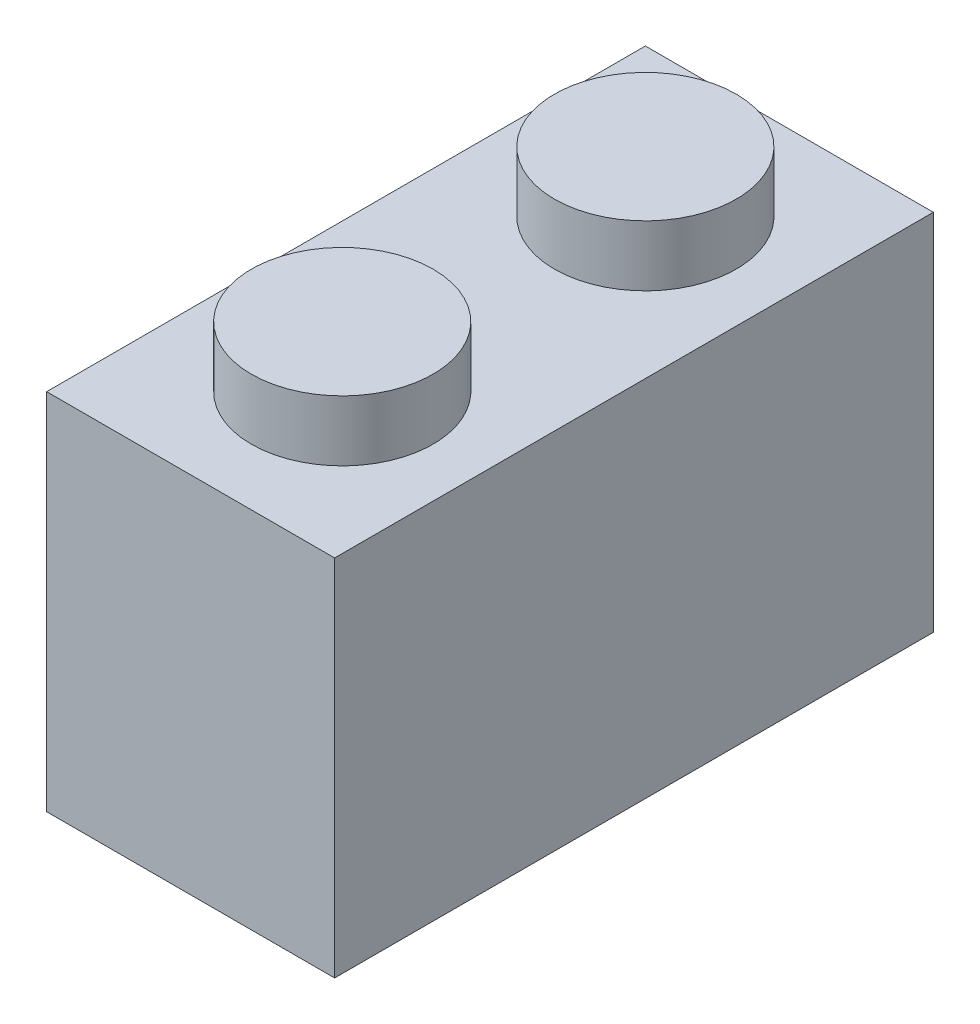
ISO-10303-21;
HEADER;
FILE_DESCRIPTION(('STEP AP214'),'2;1');
FILE_NAME('part.step','',(''),(''),'','','');
FILE_SCHEMA(('AUTOMOTIVE_DESIGN { 1 0 10303 214 1 1 1 1 }'));
ENDSEC;
DATA;
#1=APPLICATION_CONTEXT('core data for automotive mechanical design processes');
#2=APPLICATION_PROTOCOL_DEFINITION('international standard','automotive_design',2000,#1);
#3=PRODUCT_CONTEXT('',#1,'mechanical');
#4=PRODUCT('Part','Part','',(#3));
#5=PRODUCT_RELATED_PRODUCT_CATEGORY('part','',(#4));
#6=PRODUCT_DEFINITION_FORMATION('','',#4);
#7=PRODUCT_DEFINITION_CONTEXT('part definition',#1,'design');
#8=PRODUCT_DEFINITION('design','',#6,#7);
#9=PRODUCT_DEFINITION_SHAPE('','',#8);
#10=(LENGTH_UNIT() NAMED_UNIT(*) SI_UNIT(.MILLI.,.METRE.));
#11=(NAMED_UNIT(*) PLANE_ANGLE_UNIT() SI_UNIT($,.RADIAN.));
#12=(NAMED_UNIT(*) SI_UNIT($,.STERADIAN.) SOLID_ANGLE_UNIT());
#13=UNCERTAINTY_MEASURE_WITH_UNIT(LENGTH_MEASURE(1.E-05),#10,'distance_accuracy_value','');
#14=(GEOMETRIC_REPRESENTATION_CONTEXT(3) GLOBAL_UNCERTAINTY_ASSIGNED_CONTEXT((#13)) GLOBAL_UNIT_ASSIGNED_CONTEXT((#10,
#11,#12)) REPRESENTATION_CONTEXT('',''));
#15=CARTESIAN_POINT('',(0.,0.,0.));
#16=DIRECTION('',(0.,0.,1.));
#17=DIRECTION('',(1.,0.,0.));
#18=AXIS2_PLACEMENT_3D('',#15,#16,#17);
#19=CARTESIAN_POINT('',(0.,0.,-15.8));
#20=DIRECTION('',(0.,-1.,0.));
#21=DIRECTION('',(0.,0.,-1.));
#22=AXIS2_PLACEMENT_3D('',#19,#20,#21);
#23=PLANE('',#22);
#24=DIRECTION('',(1.,0.,0.));
#25=VECTOR('',#24,1.);
#26=CARTESIAN_POINT('',(0.,0.,0.));
#27=LINE('',#26,#25);
#28=CARTESIAN_POINT('',(0.,0.,0.));
#29=VERTEX_POINT('',#28);
#30=CARTESIAN_POINT('',(7.6,0.,0.));
#31=VERTEX_POINT('',#30);
#32=EDGE_CURVE('E205',#29,#31,#27,.T.);
#33=ORIENTED_EDGE('',*,*,#32,.F.);
#34=DIRECTION('',(0.,0.,1.));
#35=VECTOR('',#34,1.);
#36=CARTESIAN_POINT('',(0.,0.,-15.8));
#37=LINE('',#36,#35);
#38=CARTESIAN_POINT('',(0.,0.,-15.8));
#39=VERTEX_POINT('',#38);
#40=EDGE_CURVE('E45',#39,#29,#37,.T.);
#41=ORIENTED_EDGE('',*,*,#40,.F.);
#42=DIRECTION('',(1.,0.,0.));
#43=VECTOR('',#42,1.);
#44=CARTESIAN_POINT('',(0.,0.,-15.8));
#45=LINE('',#44,#43);
#46=CARTESIAN_POINT('',(7.6,0.,-15.8));
#47=VERTEX_POINT('',#46);
#48=EDGE_CURVE('E191',#39,#47,#45,.T.);
#49=ORIENTED_EDGE('',*,*,#48,.T.);
#50=DIRECTION('',(0.,0.,1.));
#51=VECTOR('',#50,1.);
#52=CARTESIAN_POINT('',(7.6,0.,-15.8));
#53=LINE('',#52,#51);
#54=EDGE_CURVE('E217',#47,#31,#53,.T.);
#55=ORIENTED_EDGE('',*,*,#54,.T.);
#56=EDGE_LOOP('',(#33,#41,#49,#55));
#57=FACE_BOUND('',#56,.T.);
#58=DIRECTION('',(0.,0.,1.));
#59=VECTOR('',#58,1.);
#60=CARTESIAN_POINT('',(1.2,0.,-15.8));
#61=LINE('',#60,#59);
#62=CARTESIAN_POINT('',(1.2,0.,-14.6));
#63=VERTEX_POINT('',#62);
#64=CARTESIAN_POINT('',(1.2,0.,-1.2));
#65=VERTEX_POINT('',#64);
#66=EDGE_CURVE('E134',#63,#65,#61,.T.);
#67=ORIENTED_EDGE('',*,*,#66,.T.);
#68=DIRECTION('',(1.,0.,0.));
#69=VECTOR('',#68,1.);
#70=CARTESIAN_POINT('',(0.,0.,-1.2));
#71=LINE('',#70,#69);
#72=CARTESIAN_POINT('',(6.4,0.,-1.2));
#73=VERTEX_POINT('',#72);
#74=EDGE_CURVE('E152',#65,#73,#71,.T.);
#75=ORIENTED_EDGE('',*,*,#74,.T.);
#76=DIRECTION('',(0.,0.,1.));
#77=VECTOR('',#76,1.);
#78=CARTESIAN_POINT('',(6.4,0.,-15.8));
#79=LINE('',#78,#77);
#80=CARTESIAN_POINT('',(6.4,0.,-14.6));
#81=VERTEX_POINT('',#80);
#82=EDGE_CURVE('E143',#81,#73,#79,.T.);
#83=ORIENTED_EDGE('',*,*,#82,.F.);
#84=DIRECTION('',(1.,0.,0.));
#85=VECTOR('',#84,1.);
#86=CARTESIAN_POINT('',(0.,0.,-14.6));
#87=LINE('',#86,#85);
#88=EDGE_CURVE('E59',#63,#81,#87,.T.);
#89=ORIENTED_EDGE('',*,*,#88,.F.);
#90=EDGE_LOOP('',(#67,#75,#83,#89));
#91=FACE_BOUND('',#90,.T.);
#92=ADVANCED_FACE('F41',(#57,#91),#23,.T.);
#93=CARTESIAN_POINT('',(0.,0.,-15.8));
#94=DIRECTION('',(-1.,0.,0.));
#95=DIRECTION('',(0.,0.,1.));
#96=AXIS2_PLACEMENT_3D('',#93,#94,#95);
#97=PLANE('',#96);
#98=DIRECTION('',(0.,-1.,0.));
#99=VECTOR('',#98,1.);
#100=CARTESIAN_POINT('',(0.,0.,0.));
#101=LINE('',#100,#99);
#102=CARTESIAN_POINT('',(0.,9.6,0.));
#103=VERTEX_POINT('',#102);
#104=EDGE_CURVE('E184',#103,#29,#101,.T.);
#105=ORIENTED_EDGE('',*,*,#104,.F.);
#106=DIRECTION('',(0.,0.,1.));
#107=VECTOR('',#106,1.);
#108=CARTESIAN_POINT('',(0.,9.6,-15.8));
#109=LINE('',#108,#107);
#110=CARTESIAN_POINT('',(0.,9.6,-15.8));
#111=VERTEX_POINT('',#110);
#112=EDGE_CURVE('E11',#111,#103,#109,.T.);
#113=ORIENTED_EDGE('',*,*,#112,.F.);
#114=DIRECTION('',(0.,-1.,0.));
#115=VECTOR('',#114,1.);
#116=CARTESIAN_POINT('',(0.,0.,-15.8));
#117=LINE('',#116,#115);
#118=EDGE_CURVE('E188',#111,#39,#117,.T.);
#119=ORIENTED_EDGE('',*,*,#118,.T.);
#120=ORIENTED_EDGE('',*,*,#40,.T.);
#121=EDGE_LOOP('',(#105,#113,#119,#120));
#122=FACE_BOUND('',#121,.T.);
#123=ADVANCED_FACE('F43',(#122),#97,.T.);
#124=CARTESIAN_POINT('',(0.,9.6,-15.8));
#125=DIRECTION('',(0.,1.,0.));
#126=DIRECTION('',(0.,0.,1.));
#127=AXIS2_PLACEMENT_3D('',#124,#125,#126);
#128=PLANE('',#127);
#129=CARTESIAN_POINT('',(3.9,9.6,-11.9));
#130=DIRECTION('',(0.,1.,0.));
#131=DIRECTION('',(0.,0.,1.));
#132=AXIS2_PLACEMENT_3D('',#129,#130,#131);
#133=CIRCLE('',#132,2.4);
#134=CARTESIAN_POINT('',(3.9,9.6,-9.5));
#135=VERTEX_POINT('',#134);
#136=EDGE_CURVE('E128',#135,#135,#133,.T.);
#137=ORIENTED_EDGE('',*,*,#136,.F.);
#138=EDGE_LOOP('',(#137));
#139=FACE_BOUND('',#138,.T.);
#140=CARTESIAN_POINT('',(3.9,9.6,-3.9));
#141=DIRECTION('',(0.,1.,0.));
#142=DIRECTION('',(0.,0.,1.));
#143=AXIS2_PLACEMENT_3D('',#140,#141,#142);
#144=CIRCLE('',#143,2.4);
#145=CARTESIAN_POINT('',(3.9,9.6,-1.5));
#146=VERTEX_POINT('',#145);
#147=EDGE_CURVE('E179',#146,#146,#144,.T.);
#148=ORIENTED_EDGE('',*,*,#147,.F.);
#149=EDGE_LOOP('',(#148));
#150=FACE_BOUND('',#149,.T.);
#151=DIRECTION('',(-1.,0.,0.));
#152=VECTOR('',#151,1.);
#153=CARTESIAN_POINT('',(0.,9.6,0.));
#154=LINE('',#153,#152);
#155=CARTESIAN_POINT('',(7.6,9.6,0.));
#156=VERTEX_POINT('',#155);
#157=EDGE_CURVE('E192',#156,#103,#154,.T.);
#158=ORIENTED_EDGE('',*,*,#157,.F.);
#159=DIRECTION('',(0.,0.,1.));
#160=VECTOR('',#159,1.);
#161=CARTESIAN_POINT('',(7.6,9.6,-15.8));
#162=LINE('',#161,#160);
#163=CARTESIAN_POINT('',(7.6,9.6,-15.8));
#164=VERTEX_POINT('',#163);
#165=EDGE_CURVE('E51',#164,#156,#162,.T.);
#166=ORIENTED_EDGE('',*,*,#165,.F.);
#167=DIRECTION('',(-1.,0.,0.));
#168=VECTOR('',#167,1.);
#169=CARTESIAN_POINT('',(0.,9.6,-15.8));
#170=LINE('',#169,#168);
#171=EDGE_CURVE('E199',#164,#111,#170,.T.);
#172=ORIENTED_EDGE('',*,*,#171,.T.);
#173=ORIENTED_EDGE('',*,*,#112,.T.);
#174=EDGE_LOOP('',(#158,#166,#172,#173));
#175=FACE_BOUND('',#174,.T.);
#176=ADVANCED_FACE('F224',(#139,#150,#175),#128,.T.);
#177=CARTESIAN_POINT('',(7.6,0.,-15.8));
#178=DIRECTION('',(1.,0.,0.));
#179=DIRECTION('',(0.,0.,-1.));
#180=AXIS2_PLACEMENT_3D('',#177,#178,#179);
#181=PLANE('',#180);
#182=DIRECTION('',(0.,1.,0.));
#183=VECTOR('',#182,1.);
#184=CARTESIAN_POINT('',(7.6,0.,0.));
#185=LINE('',#184,#183);
#186=EDGE_CURVE('E209',#31,#156,#185,.T.);
#187=ORIENTED_EDGE('',*,*,#186,.F.);
#188=ORIENTED_EDGE('',*,*,#54,.F.);
#189=DIRECTION('',(0.,1.,0.));
#190=VECTOR('',#189,1.);
#191=CARTESIAN_POINT('',(7.6,0.,-15.8));
#192=LINE('',#191,#190);
#193=EDGE_CURVE('E195',#47,#164,#192,.T.);
#194=ORIENTED_EDGE('',*,*,#193,.T.);
#195=ORIENTED_EDGE('',*,*,#165,.T.);
#196=EDGE_LOOP('',(#187,#188,#194,#195));
#197=FACE_BOUND('',#196,.T.);
#198=ADVANCED_FACE('F228',(#197),#181,.T.);
#199=CARTESIAN_POINT('',(0.,0.,-15.8));
#200=DIRECTION('',(0.,0.,-1.));
#201=DIRECTION('',(-1.,0.,0.));
#202=AXIS2_PLACEMENT_3D('',#199,#200,#201);
#203=PLANE('',#202);
#204=ORIENTED_EDGE('',*,*,#118,.F.);
#205=ORIENTED_EDGE('',*,*,#171,.F.);
#206=ORIENTED_EDGE('',*,*,#193,.F.);
#207=ORIENTED_EDGE('',*,*,#48,.F.);
#208=EDGE_LOOP('',(#204,#205,#206,#207));
#209=FACE_BOUND('',#208,.T.);
#210=ADVANCED_FACE('F230',(#209),#203,.T.);
#211=CARTESIAN_POINT('',(0.,0.,0.));
#212=DIRECTION('',(0.,0.,-1.));
#213=DIRECTION('',(-1.,0.,0.));
#214=AXIS2_PLACEMENT_3D('',#211,#212,#213);
#215=PLANE('',#214);
#216=ORIENTED_EDGE('',*,*,#104,.T.);
#217=ORIENTED_EDGE('',*,*,#32,.T.);
#218=ORIENTED_EDGE('',*,*,#186,.T.);
#219=ORIENTED_EDGE('',*,*,#157,.T.);
#220=EDGE_LOOP('',(#216,#217,#218,#219));
#221=FACE_BOUND('',#220,.T.);
#222=ADVANCED_FACE('F223',(#221),#215,.F.);
#223=CARTESIAN_POINT('',(3.9,11.2,-3.9));
#224=DIRECTION('',(0.,-1.,0.));
#225=DIRECTION('',(0.,0.,-1.));
#226=AXIS2_PLACEMENT_3D('',#223,#224,#225);
#227=CYLINDRICAL_SURFACE('',#226,2.4);
#228=CARTESIAN_POINT('',(3.9,11.2,-3.9));
#229=DIRECTION('',(0.,1.,0.));
#230=DIRECTION('',(0.,0.,1.));
#231=AXIS2_PLACEMENT_3D('',#228,#229,#230);
#232=CIRCLE('',#231,2.4);
#233=CARTESIAN_POINT('',(3.9,11.2,-1.5));
#234=VERTEX_POINT('',#233);
#235=EDGE_CURVE('E180',#234,#234,#232,.T.);
#236=ORIENTED_EDGE('',*,*,#235,.F.);
#237=EDGE_LOOP('',(#236));
#238=FACE_BOUND('',#237,.T.);
#239=ORIENTED_EDGE('',*,*,#147,.T.);
#240=EDGE_LOOP('',(#239));
#241=FACE_BOUND('',#240,.T.);
#242=ADVANCED_FACE('F237',(#238,#241),#227,.T.);
#243=CARTESIAN_POINT('',(3.9,11.2,-3.9));
#244=DIRECTION('',(0.,1.,0.));
#245=DIRECTION('',(0.,0.,1.));
#246=AXIS2_PLACEMENT_3D('',#243,#244,#245);
#247=PLANE('',#246);
#248=ORIENTED_EDGE('',*,*,#235,.T.);
#249=EDGE_LOOP('',(#248));
#250=FACE_BOUND('',#249,.T.);
#251=ADVANCED_FACE('F255',(#250),#247,.T.);
#252=CARTESIAN_POINT('',(3.9,11.2,-11.9));
#253=DIRECTION('',(0.,-1.,0.));
#254=DIRECTION('',(0.,0.,-1.));
#255=AXIS2_PLACEMENT_3D('',#252,#253,#254);
#256=CYLINDRICAL_SURFACE('',#255,2.4);
#257=CARTESIAN_POINT('',(3.9,11.2,-11.9));
#258=DIRECTION('',(0.,1.,0.));
#259=DIRECTION('',(0.,0.,1.));
#260=AXIS2_PLACEMENT_3D('',#257,#258,#259);
#261=CIRCLE('',#260,2.4);
#262=CARTESIAN_POINT('',(3.9,11.2,-9.5));
#263=VERTEX_POINT('',#262);
#264=EDGE_CURVE('E175',#263,#263,#261,.T.);
#265=ORIENTED_EDGE('',*,*,#264,.F.);
#266=EDGE_LOOP('',(#265));
#267=FACE_BOUND('',#266,.T.);
#268=ORIENTED_EDGE('',*,*,#136,.T.);
#269=EDGE_LOOP('',(#268));
#270=FACE_BOUND('',#269,.T.);
#271=ADVANCED_FACE('F260',(#267,#270),#256,.T.);
#272=CARTESIAN_POINT('',(3.9,11.2,-11.9));
#273=DIRECTION('',(0.,1.,0.));
#274=DIRECTION('',(0.,0.,1.));
#275=AXIS2_PLACEMENT_3D('',#272,#273,#274);
#276=PLANE('',#275);
#277=ORIENTED_EDGE('',*,*,#264,.T.);
#278=EDGE_LOOP('',(#277));
#279=FACE_BOUND('',#278,.T.);
#280=ADVANCED_FACE('F267',(#279),#276,.T.);
#281=CARTESIAN_POINT('',(1.2,0.,-15.8));
#282=DIRECTION('',(-1.,0.,0.));
#283=DIRECTION('',(0.,0.,1.));
#284=AXIS2_PLACEMENT_3D('',#281,#282,#283);
#285=PLANE('',#284);
#286=DIRECTION('',(0.,-1.,0.));
#287=VECTOR('',#286,1.);
#288=CARTESIAN_POINT('',(1.2,0.,-1.2));
#289=LINE('',#288,#287);
#290=CARTESIAN_POINT('',(1.2,8.4,-1.2));
#291=VERTEX_POINT('',#290);
#292=EDGE_CURVE('E158',#291,#65,#289,.T.);
#293=ORIENTED_EDGE('',*,*,#292,.T.);
#294=ORIENTED_EDGE('',*,*,#66,.F.);
#295=DIRECTION('',(0.,-1.,0.));
#296=VECTOR('',#295,1.);
#297=CARTESIAN_POINT('',(1.2,0.,-14.6));
#298=LINE('',#297,#296);
#299=CARTESIAN_POINT('',(1.2,8.4,-14.6));
#300=VERTEX_POINT('',#299);
#301=EDGE_CURVE('E131',#300,#63,#298,.T.);
#302=ORIENTED_EDGE('',*,*,#301,.F.);
#303=DIRECTION('',(0.,0.,1.));
#304=VECTOR('',#303,1.);
#305=CARTESIAN_POINT('',(1.2,8.4,-15.8));
#306=LINE('',#305,#304);
#307=EDGE_CURVE('E117',#300,#291,#306,.T.);
#308=ORIENTED_EDGE('',*,*,#307,.T.);
#309=EDGE_LOOP('',(#293,#294,#302,#308));
#310=FACE_BOUND('',#309,.T.);
#311=ADVANCED_FACE('F132',(#310),#285,.F.);
#312=CARTESIAN_POINT('',(0.,8.4,-15.8));
#313=DIRECTION('',(0.,1.,0.));
#314=DIRECTION('',(0.,0.,1.));
#315=AXIS2_PLACEMENT_3D('',#312,#313,#314);
#316=PLANE('',#315);
#317=CARTESIAN_POINT('',(3.9,8.4,-11.9));
#318=DIRECTION('',(0.,1.,0.));
#319=DIRECTION('',(0.,0.,1.));
#320=AXIS2_PLACEMENT_3D('',#317,#318,#319);
#321=CIRCLE('',#320,1.2);
#322=CARTESIAN_POINT('',(3.9,8.4,-10.7));
#323=VERTEX_POINT('',#322);
#324=EDGE_CURVE('E163',#323,#323,#321,.T.);
#325=ORIENTED_EDGE('',*,*,#324,.T.);
#326=EDGE_LOOP('',(#325));
#327=FACE_BOUND('',#326,.T.);
#328=CARTESIAN_POINT('',(3.9,8.4,-3.9));
#329=DIRECTION('',(0.,1.,0.));
#330=DIRECTION('',(0.,0.,1.));
#331=AXIS2_PLACEMENT_3D('',#328,#329,#330);
#332=CIRCLE('',#331,1.2);
#333=CARTESIAN_POINT('',(3.9,8.4,-2.7));
#334=VERTEX_POINT('',#333);
#335=EDGE_CURVE('E159',#334,#334,#332,.T.);
#336=ORIENTED_EDGE('',*,*,#335,.T.);
#337=EDGE_LOOP('',(#336));
#338=FACE_BOUND('',#337,.T.);
#339=DIRECTION('',(-1.,0.,0.));
#340=VECTOR('',#339,1.);
#341=CARTESIAN_POINT('',(0.,8.4,-1.2));
#342=LINE('',#341,#340);
#343=CARTESIAN_POINT('',(6.4,8.4,-1.2));
#344=VERTEX_POINT('',#343);
#345=EDGE_CURVE('E123',#344,#291,#342,.T.);
#346=ORIENTED_EDGE('',*,*,#345,.T.);
#347=ORIENTED_EDGE('',*,*,#307,.F.);
#348=DIRECTION('',(-1.,0.,0.));
#349=VECTOR('',#348,1.);
#350=CARTESIAN_POINT('',(0.,8.4,-14.6));
#351=LINE('',#350,#349);
#352=CARTESIAN_POINT('',(6.4,8.4,-14.6));
#353=VERTEX_POINT('',#352);
#354=EDGE_CURVE('E121',#353,#300,#351,.T.);
#355=ORIENTED_EDGE('',*,*,#354,.F.);
#356=DIRECTION('',(0.,0.,1.));
#357=VECTOR('',#356,1.);
#358=CARTESIAN_POINT('',(6.4,8.4,-15.8));
#359=LINE('',#358,#357);
#360=EDGE_CURVE('E129',#353,#344,#359,.T.);
#361=ORIENTED_EDGE('',*,*,#360,.T.);
#362=EDGE_LOOP('',(#346,#347,#355,#361));
#363=FACE_BOUND('',#362,.T.);
#364=ADVANCED_FACE('F119',(#327,#338,#363),#316,.F.);
#365=CARTESIAN_POINT('',(6.4,0.,-15.8));
#366=DIRECTION('',(1.,0.,0.));
#367=DIRECTION('',(0.,0.,-1.));
#368=AXIS2_PLACEMENT_3D('',#365,#366,#367);
#369=PLANE('',#368);
#370=DIRECTION('',(0.,1.,0.));
#371=VECTOR('',#370,1.);
#372=CARTESIAN_POINT('',(6.4,0.,-1.2));
#373=LINE('',#372,#371);
#374=EDGE_CURVE('E149',#73,#344,#373,.T.);
#375=ORIENTED_EDGE('',*,*,#374,.T.);
#376=ORIENTED_EDGE('',*,*,#360,.F.);
#377=DIRECTION('',(0.,1.,0.));
#378=VECTOR('',#377,1.);
#379=CARTESIAN_POINT('',(6.4,0.,-14.6));
#380=LINE('',#379,#378);
#381=EDGE_CURVE('E138',#81,#353,#380,.T.);
#382=ORIENTED_EDGE('',*,*,#381,.F.);
#383=ORIENTED_EDGE('',*,*,#82,.T.);
#384=EDGE_LOOP('',(#375,#376,#382,#383));
#385=FACE_BOUND('',#384,.T.);
#386=ADVANCED_FACE('F294',(#385),#369,.F.);
#387=CARTESIAN_POINT('',(0.,0.,-14.6));
#388=DIRECTION('',(0.,0.,-1.));
#389=DIRECTION('',(-1.,0.,0.));
#390=AXIS2_PLACEMENT_3D('',#387,#388,#389);
#391=PLANE('',#390);
#392=ORIENTED_EDGE('',*,*,#301,.T.);
#393=ORIENTED_EDGE('',*,*,#88,.T.);
#394=ORIENTED_EDGE('',*,*,#381,.T.);
#395=ORIENTED_EDGE('',*,*,#354,.T.);
#396=EDGE_LOOP('',(#392,#393,#394,#395));
#397=FACE_BOUND('',#396,.T.);
#398=ADVANCED_FACE('F137',(#397),#391,.F.);
#399=CARTESIAN_POINT('',(0.,0.,-1.2));
#400=DIRECTION('',(0.,0.,-1.));
#401=DIRECTION('',(-1.,0.,0.));
#402=AXIS2_PLACEMENT_3D('',#399,#400,#401);
#403=PLANE('',#402);
#404=ORIENTED_EDGE('',*,*,#292,.F.);
#405=ORIENTED_EDGE('',*,*,#345,.F.);
#406=ORIENTED_EDGE('',*,*,#374,.F.);
#407=ORIENTED_EDGE('',*,*,#74,.F.);
#408=EDGE_LOOP('',(#404,#405,#406,#407));
#409=FACE_BOUND('',#408,.T.);
#410=ADVANCED_FACE('F287',(#409),#403,.T.);
#411=CARTESIAN_POINT('',(3.9,11.2,-3.9));
#412=DIRECTION('',(0.,-1.,0.));
#413=DIRECTION('',(0.,0.,-1.));
#414=AXIS2_PLACEMENT_3D('',#411,#412,#413);
#415=CYLINDRICAL_SURFACE('',#414,1.2);
#416=CARTESIAN_POINT('',(3.9,10.,-3.9));
#417=DIRECTION('',(0.,1.,0.));
#418=DIRECTION('',(0.,0.,1.));
#419=AXIS2_PLACEMENT_3D('',#416,#417,#418);
#420=CIRCLE('',#419,1.2);
#421=CARTESIAN_POINT('',(3.9,10.,-2.7));
#422=VERTEX_POINT('',#421);
#423=EDGE_CURVE('E154',#422,#422,#420,.T.);
#424=ORIENTED_EDGE('',*,*,#423,.T.);
#425=EDGE_LOOP('',(#424));
#426=FACE_BOUND('',#425,.T.);
#427=ORIENTED_EDGE('',*,*,#335,.F.);
#428=EDGE_LOOP('',(#427));
#429=FACE_BOUND('',#428,.T.);
#430=ADVANCED_FACE('F283',(#426,#429),#415,.F.);
#431=CARTESIAN_POINT('',(3.9,10.,-3.9));
#432=DIRECTION('',(0.,1.,0.));
#433=DIRECTION('',(0.,0.,1.));
#434=AXIS2_PLACEMENT_3D('',#431,#432,#433);
#435=PLANE('',#434);
#436=ORIENTED_EDGE('',*,*,#423,.F.);
#437=EDGE_LOOP('',(#436));
#438=FACE_BOUND('',#437,.T.);
#439=ADVANCED_FACE('F279',(#438),#435,.F.);
#440=CARTESIAN_POINT('',(3.9,11.2,-11.9));
#441=DIRECTION('',(0.,-1.,0.));
#442=DIRECTION('',(0.,0.,-1.));
#443=AXIS2_PLACEMENT_3D('',#440,#441,#442);
#444=CYLINDRICAL_SURFACE('',#443,1.2);
#445=CARTESIAN_POINT('',(3.9,10.,-11.9));
#446=DIRECTION('',(0.,1.,0.));
#447=DIRECTION('',(0.,0.,1.));
#448=AXIS2_PLACEMENT_3D('',#445,#446,#447);
#449=CIRCLE('',#448,1.2);
#450=CARTESIAN_POINT('',(3.9,10.,-10.7));
#451=VERTEX_POINT('',#450);
#452=EDGE_CURVE('E160',#451,#451,#449,.T.);
#453=ORIENTED_EDGE('',*,*,#452,.T.);
#454=EDGE_LOOP('',(#453));
#455=FACE_BOUND('',#454,.T.);
#456=ORIENTED_EDGE('',*,*,#324,.F.);
#457=EDGE_LOOP('',(#456));
#458=FACE_BOUND('',#457,.T.);
#459=ADVANCED_FACE('F275',(#455,#458),#444,.F.);
#460=CARTESIAN_POINT('',(3.9,10.,-11.9));
#461=DIRECTION('',(0.,1.,0.));
#462=DIRECTION('',(0.,0.,1.));
#463=AXIS2_PLACEMENT_3D('',#460,#461,#462);
#464=PLANE('',#463);
#465=ORIENTED_EDGE('',*,*,#452,.F.);
#466=EDGE_LOOP('',(#465));
#467=FACE_BOUND('',#466,.T.);
#468=ADVANCED_FACE('F272',(#467),#464,.F.);
#469=CLOSED_SHELL('',(#92,#123,#176,#198,#210,#222,#242,#251,#271,#280,#311,#364,#386,#398,#410,
#430,#439,#459,#468));
#470=MANIFOLD_SOLID_BREP('B2',#469);
#471=ADVANCED_BREP_SHAPE_REPRESENTATION('',(#18,#470),#14);
#472=SHAPE_DEFINITION_REPRESENTATION(#9,#471);
ENDSEC;
END-ISO-10303-21;
